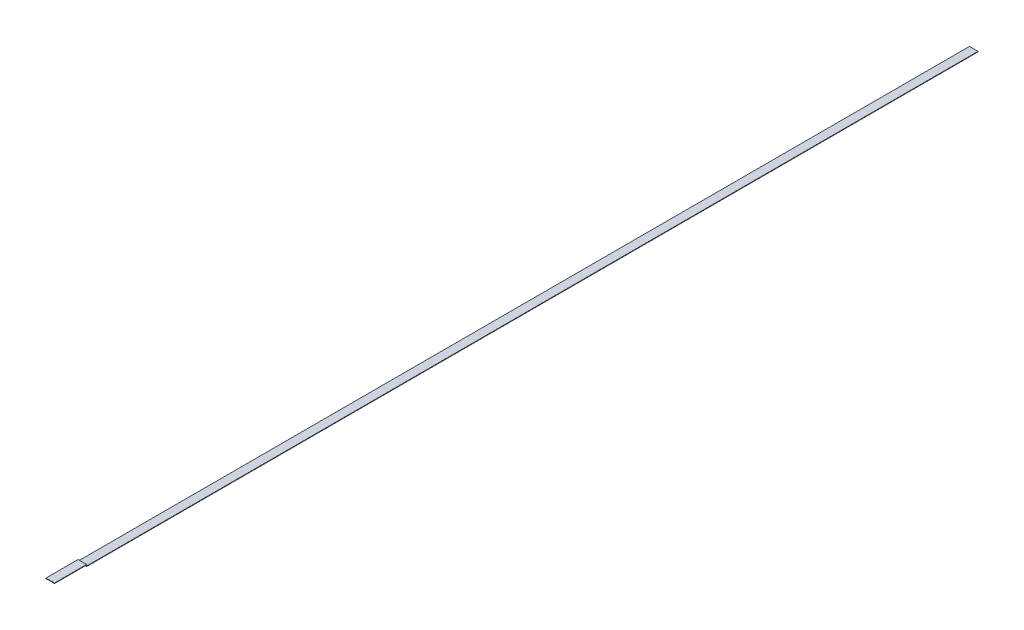
ISO-10303-21;
HEADER;
FILE_DESCRIPTION(('STEP AP214'),'2;1');
FILE_NAME('part.step','',(''),(''),'','','');
FILE_SCHEMA(('AUTOMOTIVE_DESIGN { 1 0 10303 214 1 1 1 1 }'));
ENDSEC;
DATA;
#1=APPLICATION_CONTEXT('core data for automotive mechanical design processes');
#2=APPLICATION_PROTOCOL_DEFINITION('international standard','automotive_design',2000,#1);
#3=PRODUCT_CONTEXT('',#1,'mechanical');
#4=PRODUCT('Part','Part','',(#3));
#5=PRODUCT_RELATED_PRODUCT_CATEGORY('part','',(#4));
#6=PRODUCT_DEFINITION_FORMATION('','',#4);
#7=PRODUCT_DEFINITION_CONTEXT('part definition',#1,'design');
#8=PRODUCT_DEFINITION('design','',#6,#7);
#9=PRODUCT_DEFINITION_SHAPE('','',#8);
#10=(LENGTH_UNIT() NAMED_UNIT(*) SI_UNIT(.MILLI.,.METRE.));
#11=(NAMED_UNIT(*) PLANE_ANGLE_UNIT() SI_UNIT($,.RADIAN.));
#12=(NAMED_UNIT(*) SI_UNIT($,.STERADIAN.) SOLID_ANGLE_UNIT());
#13=UNCERTAINTY_MEASURE_WITH_UNIT(LENGTH_MEASURE(1.E-05),#10,'distance_accuracy_value','');
#14=(GEOMETRIC_REPRESENTATION_CONTEXT(3) GLOBAL_UNCERTAINTY_ASSIGNED_CONTEXT((#13)) GLOBAL_UNIT_ASSIGNED_CONTEXT((#10,
#11,#12)) REPRESENTATION_CONTEXT('',''));
#15=CARTESIAN_POINT('',(0.,0.,0.));
#16=DIRECTION('',(0.,0.,1.));
#17=DIRECTION('',(1.,0.,0.));
#18=AXIS2_PLACEMENT_3D('',#15,#16,#17);
#19=CARTESIAN_POINT('',(0.,3.175,-190.5));
#20=DIRECTION('',(1.,0.,0.));
#21=DIRECTION('',(0.,0.,-1.));
#22=AXIS2_PLACEMENT_3D('',#19,#20,#21);
#23=PLANE('',#22);
#24=DIRECTION('',(0.,0.,1.));
#25=VECTOR('',#24,1.);
#26=CARTESIAN_POINT('',(0.,0.,-190.5));
#27=LINE('',#26,#25);
#28=CARTESIAN_POINT('',(0.,0.,-5486.4));
#29=VERTEX_POINT('',#28);
#30=CARTESIAN_POINT('',(0.,0.,-190.5));
#31=VERTEX_POINT('',#30);
#32=EDGE_CURVE('E105',#29,#31,#27,.T.);
#33=ORIENTED_EDGE('',*,*,#32,.T.);
#34=DIRECTION('',(0.,-1.,0.));
#35=VECTOR('',#34,1.);
#36=CARTESIAN_POINT('',(0.,3.175,-190.5));
#37=LINE('',#36,#35);
#38=CARTESIAN_POINT('',(0.,3.175,-190.5));
#39=VERTEX_POINT('',#38);
#40=EDGE_CURVE('E12',#39,#31,#37,.T.);
#41=ORIENTED_EDGE('',*,*,#40,.F.);
#42=DIRECTION('',(0.,0.,1.));
#43=VECTOR('',#42,1.);
#44=CARTESIAN_POINT('',(0.,3.175,-190.5));
#45=LINE('',#44,#43);
#46=CARTESIAN_POINT('',(0.,3.175,-5486.4));
#47=VERTEX_POINT('',#46);
#48=EDGE_CURVE('E93',#47,#39,#45,.T.);
#49=ORIENTED_EDGE('',*,*,#48,.F.);
#50=DIRECTION('',(0.,-1.,0.));
#51=VECTOR('',#50,1.);
#52=CARTESIAN_POINT('',(0.,3.175,-5486.4));
#53=LINE('',#52,#51);
#54=EDGE_CURVE('E101',#47,#29,#53,.T.);
#55=ORIENTED_EDGE('',*,*,#54,.T.);
#56=EDGE_LOOP('',(#33,#41,#49,#55));
#57=FACE_BOUND('',#56,.T.);
#58=ADVANCED_FACE('F42',(#57),#23,.F.);
#59=CARTESIAN_POINT('',(0.,3.175,-190.5));
#60=DIRECTION('',(0.,0.,-1.));
#61=DIRECTION('',(-1.,0.,0.));
#62=AXIS2_PLACEMENT_3D('',#59,#60,#61);
#63=PLANE('',#62);
#64=DIRECTION('',(1.,0.,0.));
#65=VECTOR('',#64,1.);
#66=CARTESIAN_POINT('',(0.,0.,-190.5));
#67=LINE('',#66,#65);
#68=CARTESIAN_POINT('',(50.8,0.,-190.5));
#69=VERTEX_POINT('',#68);
#70=EDGE_CURVE('E97',#31,#69,#67,.T.);
#71=ORIENTED_EDGE('',*,*,#70,.T.);
#72=DIRECTION('',(0.,-1.,0.));
#73=VECTOR('',#72,1.);
#74=CARTESIAN_POINT('',(50.8,3.175,-190.5));
#75=LINE('',#74,#73);
#76=CARTESIAN_POINT('',(50.8,3.175,-190.5));
#77=VERTEX_POINT('',#76);
#78=EDGE_CURVE('E50',#77,#69,#75,.T.);
#79=ORIENTED_EDGE('',*,*,#78,.F.);
#80=DIRECTION('',(1.,0.,0.));
#81=VECTOR('',#80,1.);
#82=CARTESIAN_POINT('',(0.,3.175,-190.5));
#83=LINE('',#82,#81);
#84=EDGE_CURVE('E88',#39,#77,#83,.T.);
#85=ORIENTED_EDGE('',*,*,#84,.F.);
#86=ORIENTED_EDGE('',*,*,#40,.T.);
#87=EDGE_LOOP('',(#71,#79,#85,#86));
#88=FACE_BOUND('',#87,.T.);
#89=ADVANCED_FACE('F96',(#88),#63,.F.);
#90=CARTESIAN_POINT('',(50.8,3.175,-190.5));
#91=DIRECTION('',(-1.,0.,0.));
#92=DIRECTION('',(0.,0.,1.));
#93=AXIS2_PLACEMENT_3D('',#90,#91,#92);
#94=PLANE('',#93);
#95=DIRECTION('',(0.,0.,-1.));
#96=VECTOR('',#95,1.);
#97=CARTESIAN_POINT('',(50.8,0.,-190.5));
#98=LINE('',#97,#96);
#99=CARTESIAN_POINT('',(50.8,0.,-5486.4));
#100=VERTEX_POINT('',#99);
#101=EDGE_CURVE('E75',#69,#100,#98,.T.);
#102=ORIENTED_EDGE('',*,*,#101,.T.);
#103=DIRECTION('',(0.,-1.,0.));
#104=VECTOR('',#103,1.);
#105=CARTESIAN_POINT('',(50.8,3.175,-5486.4));
#106=LINE('',#105,#104);
#107=CARTESIAN_POINT('',(50.8,3.175,-5486.4));
#108=VERTEX_POINT('',#107);
#109=EDGE_CURVE('E98',#108,#100,#106,.T.);
#110=ORIENTED_EDGE('',*,*,#109,.F.);
#111=DIRECTION('',(0.,0.,-1.));
#112=VECTOR('',#111,1.);
#113=CARTESIAN_POINT('',(50.8,3.175,-190.5));
#114=LINE('',#113,#112);
#115=EDGE_CURVE('E91',#77,#108,#114,.T.);
#116=ORIENTED_EDGE('',*,*,#115,.F.);
#117=ORIENTED_EDGE('',*,*,#78,.T.);
#118=EDGE_LOOP('',(#102,#110,#116,#117));
#119=FACE_BOUND('',#118,.T.);
#120=ADVANCED_FACE('F99',(#119),#94,.F.);
#121=CARTESIAN_POINT('',(0.,3.175,-5486.4));
#122=DIRECTION('',(0.,0.,1.));
#123=DIRECTION('',(1.,0.,0.));
#124=AXIS2_PLACEMENT_3D('',#121,#122,#123);
#125=PLANE('',#124);
#126=DIRECTION('',(-1.,0.,0.));
#127=VECTOR('',#126,1.);
#128=CARTESIAN_POINT('',(0.,0.,-5486.4));
#129=LINE('',#128,#127);
#130=EDGE_CURVE('E81',#100,#29,#129,.T.);
#131=ORIENTED_EDGE('',*,*,#130,.T.);
#132=ORIENTED_EDGE('',*,*,#54,.F.);
#133=DIRECTION('',(-1.,0.,0.));
#134=VECTOR('',#133,1.);
#135=CARTESIAN_POINT('',(0.,3.175,-5486.4));
#136=LINE('',#135,#134);
#137=EDGE_CURVE('E58',#108,#47,#136,.T.);
#138=ORIENTED_EDGE('',*,*,#137,.F.);
#139=ORIENTED_EDGE('',*,*,#109,.T.);
#140=EDGE_LOOP('',(#131,#132,#138,#139));
#141=FACE_BOUND('',#140,.T.);
#142=ADVANCED_FACE('F112',(#141),#125,.F.);
#143=CARTESIAN_POINT('',(0.,3.175,0.));
#144=DIRECTION('',(0.,-1.,0.));
#145=DIRECTION('',(0.,0.,-1.));
#146=AXIS2_PLACEMENT_3D('',#143,#144,#145);
#147=PLANE('',#146);
#148=ORIENTED_EDGE('',*,*,#48,.T.);
#149=ORIENTED_EDGE('',*,*,#84,.T.);
#150=ORIENTED_EDGE('',*,*,#115,.T.);
#151=ORIENTED_EDGE('',*,*,#137,.T.);
#152=EDGE_LOOP('',(#148,#149,#150,#151));
#153=FACE_BOUND('',#152,.T.);
#154=ADVANCED_FACE('F89',(#153),#147,.F.);
#155=CARTESIAN_POINT('',(0.,0.,0.));
#156=DIRECTION('',(0.,-1.,0.));
#157=DIRECTION('',(0.,0.,-1.));
#158=AXIS2_PLACEMENT_3D('',#155,#156,#157);
#159=PLANE('',#158);
#160=ORIENTED_EDGE('',*,*,#32,.F.);
#161=ORIENTED_EDGE('',*,*,#130,.F.);
#162=ORIENTED_EDGE('',*,*,#101,.F.);
#163=ORIENTED_EDGE('',*,*,#70,.F.);
#164=EDGE_LOOP('',(#160,#161,#162,#163));
#165=FACE_BOUND('',#164,.T.);
#166=ADVANCED_FACE('F115',(#165),#159,.T.);
#167=CLOSED_SHELL('',(#58,#89,#120,#142,#154,#166));
#168=MANIFOLD_SOLID_BREP('B2',#167);
#169=CARTESIAN_POINT('',(0.,11.1125,0.));
#170=DIRECTION('',(1.,0.,0.));
#171=DIRECTION('',(0.,0.,-1.));
#172=AXIS2_PLACEMENT_3D('',#169,#170,#171);
#173=PLANE('',#172);
#174=DIRECTION('',(0.,0.,1.));
#175=VECTOR('',#174,1.);
#176=CARTESIAN_POINT('',(0.,7.9375,0.));
#177=LINE('',#176,#175);
#178=CARTESIAN_POINT('',(0.,7.9375,-190.5));
#179=VERTEX_POINT('',#178);
#180=CARTESIAN_POINT('',(0.,7.9375,0.));
#181=VERTEX_POINT('',#180);
#182=EDGE_CURVE('E228',#179,#181,#177,.T.);
#183=ORIENTED_EDGE('',*,*,#182,.T.);
#184=DIRECTION('',(0.,-1.,0.));
#185=VECTOR('',#184,1.);
#186=CARTESIAN_POINT('',(0.,11.1125,0.));
#187=LINE('',#186,#185);
#188=CARTESIAN_POINT('',(0.,11.1125,0.));
#189=VERTEX_POINT('',#188);
#190=EDGE_CURVE('E40',#189,#181,#187,.T.);
#191=ORIENTED_EDGE('',*,*,#190,.F.);
#192=DIRECTION('',(0.,0.,1.));
#193=VECTOR('',#192,1.);
#194=CARTESIAN_POINT('',(0.,11.1125,0.));
#195=LINE('',#194,#193);
#196=CARTESIAN_POINT('',(0.,11.1125,-190.5));
#197=VERTEX_POINT('',#196);
#198=EDGE_CURVE('E216',#197,#189,#195,.T.);
#199=ORIENTED_EDGE('',*,*,#198,.F.);
#200=DIRECTION('',(0.,-1.,0.));
#201=VECTOR('',#200,1.);
#202=CARTESIAN_POINT('',(0.,11.1125,-190.5));
#203=LINE('',#202,#201);
#204=EDGE_CURVE('E224',#197,#179,#203,.T.);
#205=ORIENTED_EDGE('',*,*,#204,.T.);
#206=EDGE_LOOP('',(#183,#191,#199,#205));
#207=FACE_BOUND('',#206,.T.);
#208=ADVANCED_FACE('F165',(#207),#173,.F.);
#209=CARTESIAN_POINT('',(0.,11.1125,0.));
#210=DIRECTION('',(0.,0.,-1.));
#211=DIRECTION('',(-1.,0.,0.));
#212=AXIS2_PLACEMENT_3D('',#209,#210,#211);
#213=PLANE('',#212);
#214=DIRECTION('',(1.,0.,0.));
#215=VECTOR('',#214,1.);
#216=CARTESIAN_POINT('',(0.,7.9375,0.));
#217=LINE('',#216,#215);
#218=CARTESIAN_POINT('',(50.8,7.9375,0.));
#219=VERTEX_POINT('',#218);
#220=EDGE_CURVE('E220',#181,#219,#217,.T.);
#221=ORIENTED_EDGE('',*,*,#220,.T.);
#222=DIRECTION('',(0.,-1.,0.));
#223=VECTOR('',#222,1.);
#224=CARTESIAN_POINT('',(50.8,11.1125,0.));
#225=LINE('',#224,#223);
#226=CARTESIAN_POINT('',(50.8,11.1125,0.));
#227=VERTEX_POINT('',#226);
#228=EDGE_CURVE('E173',#227,#219,#225,.T.);
#229=ORIENTED_EDGE('',*,*,#228,.F.);
#230=DIRECTION('',(1.,0.,0.));
#231=VECTOR('',#230,1.);
#232=CARTESIAN_POINT('',(0.,11.1125,0.));
#233=LINE('',#232,#231);
#234=EDGE_CURVE('E211',#189,#227,#233,.T.);
#235=ORIENTED_EDGE('',*,*,#234,.F.);
#236=ORIENTED_EDGE('',*,*,#190,.T.);
#237=EDGE_LOOP('',(#221,#229,#235,#236));
#238=FACE_BOUND('',#237,.T.);
#239=ADVANCED_FACE('F219',(#238),#213,.F.);
#240=CARTESIAN_POINT('',(50.8,11.1125,0.));
#241=DIRECTION('',(-1.,0.,0.));
#242=DIRECTION('',(0.,0.,1.));
#243=AXIS2_PLACEMENT_3D('',#240,#241,#242);
#244=PLANE('',#243);
#245=DIRECTION('',(0.,0.,-1.));
#246=VECTOR('',#245,1.);
#247=CARTESIAN_POINT('',(50.8,7.9375,0.));
#248=LINE('',#247,#246);
#249=CARTESIAN_POINT('',(50.8,7.9375,-190.5));
#250=VERTEX_POINT('',#249);
#251=EDGE_CURVE('E198',#219,#250,#248,.T.);
#252=ORIENTED_EDGE('',*,*,#251,.T.);
#253=DIRECTION('',(0.,-1.,0.));
#254=VECTOR('',#253,1.);
#255=CARTESIAN_POINT('',(50.8,11.1125,-190.5));
#256=LINE('',#255,#254);
#257=CARTESIAN_POINT('',(50.8,11.1125,-190.5));
#258=VERTEX_POINT('',#257);
#259=EDGE_CURVE('E221',#258,#250,#256,.T.);
#260=ORIENTED_EDGE('',*,*,#259,.F.);
#261=DIRECTION('',(0.,0.,-1.));
#262=VECTOR('',#261,1.);
#263=CARTESIAN_POINT('',(50.8,11.1125,0.));
#264=LINE('',#263,#262);
#265=EDGE_CURVE('E214',#227,#258,#264,.T.);
#266=ORIENTED_EDGE('',*,*,#265,.F.);
#267=ORIENTED_EDGE('',*,*,#228,.T.);
#268=EDGE_LOOP('',(#252,#260,#266,#267));
#269=FACE_BOUND('',#268,.T.);
#270=ADVANCED_FACE('F222',(#269),#244,.F.);
#271=CARTESIAN_POINT('',(0.,11.1125,-190.5));
#272=DIRECTION('',(0.,0.,1.));
#273=DIRECTION('',(1.,0.,0.));
#274=AXIS2_PLACEMENT_3D('',#271,#272,#273);
#275=PLANE('',#274);
#276=DIRECTION('',(-1.,0.,0.));
#277=VECTOR('',#276,1.);
#278=CARTESIAN_POINT('',(0.,7.9375,-190.5));
#279=LINE('',#278,#277);
#280=EDGE_CURVE('E204',#250,#179,#279,.T.);
#281=ORIENTED_EDGE('',*,*,#280,.T.);
#282=ORIENTED_EDGE('',*,*,#204,.F.);
#283=DIRECTION('',(-1.,0.,0.));
#284=VECTOR('',#283,1.);
#285=CARTESIAN_POINT('',(0.,11.1125,-190.5));
#286=LINE('',#285,#284);
#287=EDGE_CURVE('E181',#258,#197,#286,.T.);
#288=ORIENTED_EDGE('',*,*,#287,.F.);
#289=ORIENTED_EDGE('',*,*,#259,.T.);
#290=EDGE_LOOP('',(#281,#282,#288,#289));
#291=FACE_BOUND('',#290,.T.);
#292=ADVANCED_FACE('F235',(#291),#275,.F.);
#293=CARTESIAN_POINT('',(0.,11.1125,0.));
#294=DIRECTION('',(0.,-1.,0.));
#295=DIRECTION('',(0.,0.,-1.));
#296=AXIS2_PLACEMENT_3D('',#293,#294,#295);
#297=PLANE('',#296);
#298=ORIENTED_EDGE('',*,*,#198,.T.);
#299=ORIENTED_EDGE('',*,*,#234,.T.);
#300=ORIENTED_EDGE('',*,*,#265,.T.);
#301=ORIENTED_EDGE('',*,*,#287,.T.);
#302=EDGE_LOOP('',(#298,#299,#300,#301));
#303=FACE_BOUND('',#302,.T.);
#304=ADVANCED_FACE('F212',(#303),#297,.F.);
#305=CARTESIAN_POINT('',(0.,7.9375,0.));
#306=DIRECTION('',(0.,-1.,0.));
#307=DIRECTION('',(0.,0.,-1.));
#308=AXIS2_PLACEMENT_3D('',#305,#306,#307);
#309=PLANE('',#308);
#310=ORIENTED_EDGE('',*,*,#182,.F.);
#311=ORIENTED_EDGE('',*,*,#280,.F.);
#312=ORIENTED_EDGE('',*,*,#251,.F.);
#313=ORIENTED_EDGE('',*,*,#220,.F.);
#314=EDGE_LOOP('',(#310,#311,#312,#313));
#315=FACE_BOUND('',#314,.T.);
#316=ADVANCED_FACE('F238',(#315),#309,.T.);
#317=CLOSED_SHELL('',(#208,#239,#270,#292,#304,#316));
#318=MANIFOLD_SOLID_BREP('B6',#317);
#319=ADVANCED_BREP_SHAPE_REPRESENTATION('',(#18,#168,#318),#14);
#320=SHAPE_DEFINITION_REPRESENTATION(#9,#319);
ENDSEC;
END-ISO-10303-21;
